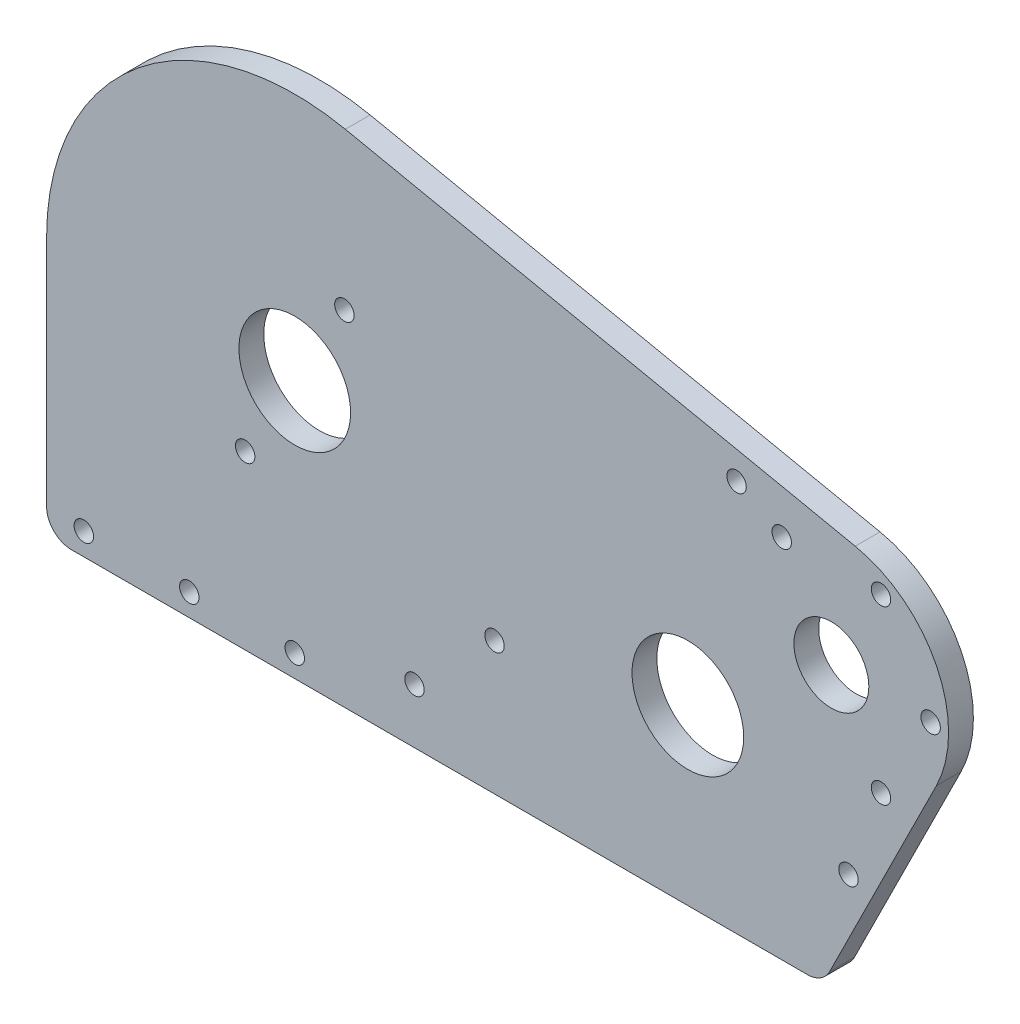
ISO-10303-21;
HEADER;
FILE_DESCRIPTION(('STEP AP214'),'2;1');
FILE_NAME('part.step','',(''),(''),'','','');
FILE_SCHEMA(('AUTOMOTIVE_DESIGN { 1 0 10303 214 1 1 1 1 }'));
ENDSEC;
DATA;
#1=APPLICATION_CONTEXT('core data for automotive mechanical design processes');
#2=APPLICATION_PROTOCOL_DEFINITION('international standard','automotive_design',2000,#1);
#3=PRODUCT_CONTEXT('',#1,'mechanical');
#4=PRODUCT('Part','Part','',(#3));
#5=PRODUCT_RELATED_PRODUCT_CATEGORY('part','',(#4));
#6=PRODUCT_DEFINITION_FORMATION('','',#4);
#7=PRODUCT_DEFINITION_CONTEXT('part definition',#1,'design');
#8=PRODUCT_DEFINITION('design','',#6,#7);
#9=PRODUCT_DEFINITION_SHAPE('','',#8);
#10=(LENGTH_UNIT() NAMED_UNIT(*) SI_UNIT(.MILLI.,.METRE.));
#11=(NAMED_UNIT(*) PLANE_ANGLE_UNIT() SI_UNIT($,.RADIAN.));
#12=(NAMED_UNIT(*) SI_UNIT($,.STERADIAN.) SOLID_ANGLE_UNIT());
#13=UNCERTAINTY_MEASURE_WITH_UNIT(LENGTH_MEASURE(1.E-05),#10,'distance_accuracy_value','');
#14=(GEOMETRIC_REPRESENTATION_CONTEXT(3) GLOBAL_UNCERTAINTY_ASSIGNED_CONTEXT((#13)) GLOBAL_UNIT_ASSIGNED_CONTEXT((#10,
#11,#12)) REPRESENTATION_CONTEXT('',''));
#15=CARTESIAN_POINT('',(0.,0.,0.));
#16=DIRECTION('',(0.,0.,1.));
#17=DIRECTION('',(1.,0.,0.));
#18=AXIS2_PLACEMENT_3D('',#15,#16,#17);
#19=CARTESIAN_POINT('',(152.4,220.726,6.35));
#20=DIRECTION('',(0.,0.,1.));
#21=DIRECTION('',(1.,0.,0.));
#22=AXIS2_PLACEMENT_3D('',#19,#20,#21);
#23=PLANE('',#22);
#24=CARTESIAN_POINT('',(139.7,198.728954743875,6.35));
#25=DIRECTION('',(0.,0.,1.));
#26=DIRECTION('',(1.,0.,0.));
#27=AXIS2_PLACEMENT_3D('',#24,#25,#26);
#28=CIRCLE('',#27,2.48920000000001);
#29=CARTESIAN_POINT('',(142.1892,198.728954743875,6.35));
#30=VERTEX_POINT('',#29);
#31=EDGE_CURVE('E276',#30,#30,#28,.T.);
#32=ORIENTED_EDGE('',*,*,#31,.F.);
#33=EDGE_LOOP('',(#32));
#34=FACE_BOUND('',#33,.T.);
#35=CARTESIAN_POINT('',(165.1,242.723045256125,6.35));
#36=DIRECTION('',(0.,0.,1.));
#37=DIRECTION('',(1.,0.,0.));
#38=AXIS2_PLACEMENT_3D('',#35,#36,#37);
#39=CIRCLE('',#38,2.48920000000001);
#40=CARTESIAN_POINT('',(167.5892,242.723045256125,6.35));
#41=VERTEX_POINT('',#40);
#42=EDGE_CURVE('E273',#41,#41,#39,.T.);
#43=ORIENTED_EDGE('',*,*,#42,.F.);
#44=EDGE_LOOP('',(#43));
#45=FACE_BOUND('',#44,.T.);
#46=CARTESIAN_POINT('',(289.700470913641,226.372782487758,6.35));
#47=DIRECTION('',(0.,0.,1.));
#48=DIRECTION('',(1.,0.,0.));
#49=AXIS2_PLACEMENT_3D('',#46,#47,#48);
#50=CIRCLE('',#49,9.5885);
#51=CARTESIAN_POINT('',(299.288970913641,226.372782487758,6.35));
#52=VERTEX_POINT('',#51);
#53=EDGE_CURVE('E255',#52,#52,#50,.T.);
#54=ORIENTED_EDGE('',*,*,#53,.F.);
#55=EDGE_LOOP('',(#54));
#56=FACE_BOUND('',#55,.T.);
#57=CARTESIAN_POINT('',(98.425,160.401,6.35));
#58=DIRECTION('',(0.,0.,1.));
#59=DIRECTION('',(1.,0.,0.));
#60=AXIS2_PLACEMENT_3D('',#57,#58,#59);
#61=CIRCLE('',#60,2.48920000000002);
#62=CARTESIAN_POINT('',(100.9142,160.401,6.35));
#63=VERTEX_POINT('',#62);
#64=EDGE_CURVE('E243',#63,#63,#61,.T.);
#65=ORIENTED_EDGE('',*,*,#64,.F.);
#66=EDGE_LOOP('',(#65));
#67=FACE_BOUND('',#66,.T.);
#68=CARTESIAN_POINT('',(152.4,160.401,6.35));
#69=DIRECTION('',(0.,0.,1.));
#70=DIRECTION('',(1.,0.,0.));
#71=AXIS2_PLACEMENT_3D('',#68,#69,#70);
#72=CIRCLE('',#71,2.48920000000001);
#73=CARTESIAN_POINT('',(154.8892,160.401,6.35));
#74=VERTEX_POINT('',#73);
#75=EDGE_CURVE('E231',#74,#74,#72,.T.);
#76=ORIENTED_EDGE('',*,*,#75,.F.);
#77=EDGE_LOOP('',(#76));
#78=FACE_BOUND('',#77,.T.);
#79=CARTESIAN_POINT('',(203.511307769551,188.683218549473,6.35));
#80=DIRECTION('',(0.,0.,1.));
#81=DIRECTION('',(1.,0.,0.));
#82=AXIS2_PLACEMENT_3D('',#79,#80,#81);
#83=CIRCLE('',#82,2.48920000000001);
#84=CARTESIAN_POINT('',(206.000507769551,188.683218549473,6.35));
#85=VERTEX_POINT('',#84);
#86=EDGE_CURVE('E219',#85,#85,#83,.T.);
#87=ORIENTED_EDGE('',*,*,#86,.F.);
#88=EDGE_LOOP('',(#87));
#89=FACE_BOUND('',#88,.T.);
#90=CARTESIAN_POINT('',(265.444839337782,254.926075850454,6.35));
#91=DIRECTION('',(0.,0.,1.));
#92=DIRECTION('',(1.,0.,0.));
#93=AXIS2_PLACEMENT_3D('',#90,#91,#92);
#94=CIRCLE('',#93,2.48920000000001);
#95=CARTESIAN_POINT('',(267.934039337782,254.926075850454,6.35));
#96=VERTEX_POINT('',#95);
#97=EDGE_CURVE('E207',#96,#96,#94,.T.);
#98=ORIENTED_EDGE('',*,*,#97,.F.);
#99=EDGE_LOOP('',(#98));
#100=FACE_BOUND('',#99,.T.);
#101=CARTESIAN_POINT('',(302.400470913641,248.369827743882,6.35));
#102=DIRECTION('',(0.,0.,1.));
#103=DIRECTION('',(1.,0.,0.));
#104=AXIS2_PLACEMENT_3D('',#101,#102,#103);
#105=CIRCLE('',#104,2.48919999999983);
#106=CARTESIAN_POINT('',(304.889670913641,248.369827743882,6.35));
#107=VERTEX_POINT('',#106);
#108=EDGE_CURVE('E195',#107,#107,#105,.T.);
#109=ORIENTED_EDGE('',*,*,#108,.F.);
#110=EDGE_LOOP('',(#109));
#111=FACE_BOUND('',#110,.T.);
#112=CARTESIAN_POINT('',(302.400470913641,204.375737231633,6.35));
#113=DIRECTION('',(0.,0.,1.));
#114=DIRECTION('',(1.,0.,0.));
#115=AXIS2_PLACEMENT_3D('',#112,#113,#114);
#116=CIRCLE('',#115,2.48920000000001);
#117=CARTESIAN_POINT('',(304.889670913641,204.375737231633,6.35));
#118=VERTEX_POINT('',#117);
#119=EDGE_CURVE('E181',#118,#118,#116,.T.);
#120=ORIENTED_EDGE('',*,*,#119,.F.);
#121=EDGE_LOOP('',(#120));
#122=FACE_BOUND('',#121,.T.);
#123=DIRECTION('',(1.,0.,0.));
#124=VECTOR('',#123,1.);
#125=CARTESIAN_POINT('',(88.8999999999999,154.686,6.35));
#126=LINE('',#125,#124);
#127=CARTESIAN_POINT('',(95.2499999999999,154.686,6.35));
#128=VERTEX_POINT('',#127);
#129=CARTESIAN_POINT('',(283.578317094878,154.686,6.35));
#130=VERTEX_POINT('',#129);
#131=EDGE_CURVE('E109',#128,#130,#126,.T.);
#132=ORIENTED_EDGE('',*,*,#131,.T.);
#133=CARTESIAN_POINT('',(283.578317094878,161.036,6.35));
#134=DIRECTION('',(0.,0.,1.));
#135=DIRECTION('',(1.,0.,0.));
#136=AXIS2_PLACEMENT_3D('',#133,#134,#135);
#137=CIRCLE('',#136,6.35);
#138=CARTESIAN_POINT('',(289.262390482921,158.205132691323,6.35));
#139=VERTEX_POINT('',#138);
#140=EDGE_CURVE('E45',#130,#139,#137,.T.);
#141=ORIENTED_EDGE('',*,*,#140,.T.);
#142=DIRECTION('',(0.44580587538221,0.895129667408416,0.));
#143=VECTOR('',#142,1.);
#144=CARTESIAN_POINT('',(287.509739345144,154.686,6.35));
#145=LINE('',#144,#143);
#146=CARTESIAN_POINT('',(316.552033598758,212.999765321568,6.35));
#147=VERTEX_POINT('',#146);
#148=EDGE_CURVE('E145',#139,#147,#145,.T.);
#149=ORIENTED_EDGE('',*,*,#148,.T.);
#150=CARTESIAN_POINT('',(289.700470913641,226.372782487758,6.35));
#151=DIRECTION('',(0.,0.,1.));
#152=DIRECTION('',(1.,0.,0.));
#153=AXIS2_PLACEMENT_3D('',#150,#151,#152);
#154=CIRCLE('',#153,29.9973999999995);
#155=CARTESIAN_POINT('',(295.812286775086,255.740957671718,6.35));
#156=VERTEX_POINT('',#155);
#157=EDGE_CURVE('E153',#147,#156,#154,.T.);
#158=ORIENTED_EDGE('',*,*,#157,.T.);
#159=DIRECTION('',(-0.979024021547217,0.203744853268775,0.));
#160=VECTOR('',#159,1.);
#161=CARTESIAN_POINT('',(165.337798182567,282.894025368248,6.35));
#162=LINE('',#161,#160);
#163=CARTESIAN_POINT('',(165.337798182567,282.894025368248,6.35));
#164=VERTEX_POINT('',#163);
#165=EDGE_CURVE('E115',#156,#164,#162,.T.);
#166=ORIENTED_EDGE('',*,*,#165,.T.);
#167=CARTESIAN_POINT('',(152.4,220.726,6.35));
#168=DIRECTION('',(0.,0.,1.));
#169=DIRECTION('',(1.,0.,0.));
#170=AXIS2_PLACEMENT_3D('',#167,#168,#169);
#171=CIRCLE('',#170,63.5);
#172=CARTESIAN_POINT('',(88.8999999999999,220.726,6.35));
#173=VERTEX_POINT('',#172);
#174=EDGE_CURVE('E110',#164,#173,#171,.T.);
#175=ORIENTED_EDGE('',*,*,#174,.T.);
#176=DIRECTION('',(0.,-1.,0.));
#177=VECTOR('',#176,1.);
#178=CARTESIAN_POINT('',(88.8999999999999,220.726,6.35));
#179=LINE('',#178,#177);
#180=CARTESIAN_POINT('',(88.8999999999999,161.036,6.35));
#181=VERTEX_POINT('',#180);
#182=EDGE_CURVE('E101',#173,#181,#179,.T.);
#183=ORIENTED_EDGE('',*,*,#182,.T.);
#184=CARTESIAN_POINT('',(95.2499999999999,161.036,6.35));
#185=DIRECTION('',(0.,0.,1.));
#186=DIRECTION('',(1.,0.,0.));
#187=AXIS2_PLACEMENT_3D('',#184,#185,#186);
#188=CIRCLE('',#187,6.35);
#189=EDGE_CURVE('E142',#181,#128,#188,.T.);
#190=ORIENTED_EDGE('',*,*,#189,.T.);
#191=EDGE_LOOP('',(#132,#141,#149,#158,#166,#175,#183,#190));
#192=FACE_BOUND('',#191,.T.);
#193=CARTESIAN_POINT('',(315.100470913641,226.372782487758,6.35));
#194=DIRECTION('',(0.,0.,1.));
#195=DIRECTION('',(1.,0.,0.));
#196=AXIS2_PLACEMENT_3D('',#193,#194,#195);
#197=CIRCLE('',#196,2.48920000000012);
#198=CARTESIAN_POINT('',(317.589670913641,226.372782487758,6.35));
#199=VERTEX_POINT('',#198);
#200=EDGE_CURVE('E190',#199,#199,#197,.T.);
#201=ORIENTED_EDGE('',*,*,#200,.F.);
#202=EDGE_LOOP('',(#201));
#203=FACE_BOUND('',#202,.T.);
#204=CARTESIAN_POINT('',(277.000470913641,248.369827743882,6.35));
#205=DIRECTION('',(0.,0.,1.));
#206=DIRECTION('',(1.,0.,0.));
#207=AXIS2_PLACEMENT_3D('',#204,#205,#206);
#208=CIRCLE('',#207,2.48919999999995);
#209=CARTESIAN_POINT('',(279.489670913641,248.369827743882,6.35));
#210=VERTEX_POINT('',#209);
#211=EDGE_CURVE('E201',#210,#210,#208,.T.);
#212=ORIENTED_EDGE('',*,*,#211,.F.);
#213=EDGE_LOOP('',(#212));
#214=FACE_BOUND('',#213,.T.);
#215=CARTESIAN_POINT('',(294.088813848959,182.139933311133,6.35));
#216=DIRECTION('',(0.,0.,1.));
#217=DIRECTION('',(1.,0.,0.));
#218=AXIS2_PLACEMENT_3D('',#215,#216,#217);
#219=CIRCLE('',#218,2.48920000000001);
#220=CARTESIAN_POINT('',(296.578013848959,182.139933311133,6.35));
#221=VERTEX_POINT('',#220);
#222=EDGE_CURVE('E213',#221,#221,#219,.T.);
#223=ORIENTED_EDGE('',*,*,#222,.F.);
#224=EDGE_LOOP('',(#223));
#225=FACE_BOUND('',#224,.T.);
#226=CARTESIAN_POINT('',(183.030900697863,168.756263157895,6.35));
#227=DIRECTION('',(0.,0.,1.));
#228=DIRECTION('',(1.,0.,0.));
#229=AXIS2_PLACEMENT_3D('',#226,#227,#228);
#230=CIRCLE('',#229,2.48920000000001);
#231=CARTESIAN_POINT('',(185.520100697863,168.756263157895,6.35));
#232=VERTEX_POINT('',#231);
#233=EDGE_CURVE('E225',#232,#232,#230,.T.);
#234=ORIENTED_EDGE('',*,*,#233,.F.);
#235=EDGE_LOOP('',(#234));
#236=FACE_BOUND('',#235,.T.);
#237=CARTESIAN_POINT('',(125.4125,160.401,6.35));
#238=DIRECTION('',(0.,0.,1.));
#239=DIRECTION('',(1.,0.,0.));
#240=AXIS2_PLACEMENT_3D('',#237,#238,#239);
#241=CIRCLE('',#240,2.48920000000001);
#242=CARTESIAN_POINT('',(127.9017,160.401,6.35));
#243=VERTEX_POINT('',#242);
#244=EDGE_CURVE('E237',#243,#243,#241,.T.);
#245=ORIENTED_EDGE('',*,*,#244,.F.);
#246=EDGE_LOOP('',(#245));
#247=FACE_BOUND('',#246,.T.);
#248=CARTESIAN_POINT('',(252.978868555974,199.136,6.35));
#249=DIRECTION('',(0.,0.,1.));
#250=DIRECTION('',(1.,0.,0.));
#251=AXIS2_PLACEMENT_3D('',#248,#249,#250);
#252=CIRCLE('',#251,14.2875);
#253=CARTESIAN_POINT('',(267.266368555974,199.136,6.35));
#254=VERTEX_POINT('',#253);
#255=EDGE_CURVE('E249',#254,#254,#252,.T.);
#256=ORIENTED_EDGE('',*,*,#255,.F.);
#257=EDGE_LOOP('',(#256));
#258=FACE_BOUND('',#257,.T.);
#259=CARTESIAN_POINT('',(152.4,220.726,6.35));
#260=DIRECTION('',(0.,0.,1.));
#261=DIRECTION('',(1.,0.,0.));
#262=AXIS2_PLACEMENT_3D('',#259,#260,#261);
#263=CIRCLE('',#262,14.2875);
#264=CARTESIAN_POINT('',(166.6875,220.726,6.35));
#265=VERTEX_POINT('',#264);
#266=EDGE_CURVE('E261',#265,#265,#263,.T.);
#267=ORIENTED_EDGE('',*,*,#266,.F.);
#268=EDGE_LOOP('',(#267));
#269=FACE_BOUND('',#268,.T.);
#270=ADVANCED_FACE('F37',(#34,#45,#56,#67,#78,#89,#100,#111,#122,#192,#203,#214,#225,#236,#247,
#258,#269),#23,.T.);
#271=CARTESIAN_POINT('',(152.4,220.726,0.));
#272=DIRECTION('',(0.,0.,1.));
#273=DIRECTION('',(1.,0.,0.));
#274=AXIS2_PLACEMENT_3D('',#271,#272,#273);
#275=PLANE('',#274);
#276=CARTESIAN_POINT('',(139.7,198.728954743875,0.));
#277=DIRECTION('',(0.,0.,1.));
#278=DIRECTION('',(1.,0.,0.));
#279=AXIS2_PLACEMENT_3D('',#276,#277,#278);
#280=CIRCLE('',#279,2.48920000000001);
#281=CARTESIAN_POINT('',(142.1892,198.728954743875,0.));
#282=VERTEX_POINT('',#281);
#283=EDGE_CURVE('E267',#282,#282,#280,.T.);
#284=ORIENTED_EDGE('',*,*,#283,.T.);
#285=EDGE_LOOP('',(#284));
#286=FACE_BOUND('',#285,.T.);
#287=CARTESIAN_POINT('',(165.1,242.723045256125,0.));
#288=DIRECTION('',(0.,0.,1.));
#289=DIRECTION('',(1.,0.,0.));
#290=AXIS2_PLACEMENT_3D('',#287,#288,#289);
#291=CIRCLE('',#290,2.48920000000001);
#292=CARTESIAN_POINT('',(167.5892,242.723045256125,0.));
#293=VERTEX_POINT('',#292);
#294=EDGE_CURVE('E270',#293,#293,#291,.T.);
#295=ORIENTED_EDGE('',*,*,#294,.T.);
#296=EDGE_LOOP('',(#295));
#297=FACE_BOUND('',#296,.T.);
#298=DIRECTION('',(0.44580587538221,0.895129667408416,0.));
#299=VECTOR('',#298,1.);
#300=CARTESIAN_POINT('',(287.509739345144,154.686,0.));
#301=LINE('',#300,#299);
#302=CARTESIAN_POINT('',(289.262390482921,158.205132691323,0.));
#303=VERTEX_POINT('',#302);
#304=CARTESIAN_POINT('',(316.552033598758,212.999765321568,0.));
#305=VERTEX_POINT('',#304);
#306=EDGE_CURVE('E162',#303,#305,#301,.T.);
#307=ORIENTED_EDGE('',*,*,#306,.F.);
#308=CARTESIAN_POINT('',(283.578317094878,161.036,0.));
#309=DIRECTION('',(0.,0.,1.));
#310=DIRECTION('',(1.,0.,0.));
#311=AXIS2_PLACEMENT_3D('',#308,#309,#310);
#312=CIRCLE('',#311,6.35);
#313=CARTESIAN_POINT('',(283.578317094878,154.686,0.));
#314=VERTEX_POINT('',#313);
#315=EDGE_CURVE('E136',#303,#314,#312,.F.);
#316=ORIENTED_EDGE('',*,*,#315,.T.);
#317=DIRECTION('',(1.,0.,0.));
#318=VECTOR('',#317,1.);
#319=CARTESIAN_POINT('',(260.35,154.686,0.));
#320=LINE('',#319,#318);
#321=CARTESIAN_POINT('',(95.2499999999999,154.686,0.));
#322=VERTEX_POINT('',#321);
#323=EDGE_CURVE('E160',#322,#314,#320,.T.);
#324=ORIENTED_EDGE('',*,*,#323,.F.);
#325=CARTESIAN_POINT('',(95.2499999999999,161.036,0.));
#326=DIRECTION('',(0.,0.,1.));
#327=DIRECTION('',(1.,0.,0.));
#328=AXIS2_PLACEMENT_3D('',#325,#326,#327);
#329=CIRCLE('',#328,6.35);
#330=CARTESIAN_POINT('',(88.8999999999999,161.036,0.));
#331=VERTEX_POINT('',#330);
#332=EDGE_CURVE('E128',#322,#331,#329,.F.);
#333=ORIENTED_EDGE('',*,*,#332,.T.);
#334=DIRECTION('',(0.,-1.,0.));
#335=VECTOR('',#334,1.);
#336=CARTESIAN_POINT('',(88.8999999999999,220.726,0.));
#337=LINE('',#336,#335);
#338=CARTESIAN_POINT('',(88.8999999999999,220.726,0.));
#339=VERTEX_POINT('',#338);
#340=EDGE_CURVE('E165',#339,#331,#337,.T.);
#341=ORIENTED_EDGE('',*,*,#340,.F.);
#342=CARTESIAN_POINT('',(152.4,220.726,0.));
#343=DIRECTION('',(0.,0.,1.));
#344=DIRECTION('',(1.,0.,0.));
#345=AXIS2_PLACEMENT_3D('',#342,#343,#344);
#346=CIRCLE('',#345,63.5);
#347=CARTESIAN_POINT('',(165.337798182567,282.894025368248,0.));
#348=VERTEX_POINT('',#347);
#349=EDGE_CURVE('E123',#348,#339,#346,.T.);
#350=ORIENTED_EDGE('',*,*,#349,.F.);
#351=DIRECTION('',(-0.979024021547217,0.203744853268775,0.));
#352=VECTOR('',#351,1.);
#353=CARTESIAN_POINT('',(165.337798182567,282.894025368248,0.));
#354=LINE('',#353,#352);
#355=CARTESIAN_POINT('',(295.812286775086,255.740957671718,0.));
#356=VERTEX_POINT('',#355);
#357=EDGE_CURVE('E119',#356,#348,#354,.T.);
#358=ORIENTED_EDGE('',*,*,#357,.F.);
#359=CARTESIAN_POINT('',(289.700470913641,226.372782487758,0.));
#360=DIRECTION('',(0.,0.,1.));
#361=DIRECTION('',(1.,0.,0.));
#362=AXIS2_PLACEMENT_3D('',#359,#360,#361);
#363=CIRCLE('',#362,29.9973999999995);
#364=EDGE_CURVE('E167',#305,#356,#363,.T.);
#365=ORIENTED_EDGE('',*,*,#364,.F.);
#366=EDGE_LOOP('',(#307,#316,#324,#333,#341,#350,#358,#365));
#367=FACE_BOUND('',#366,.T.);
#368=CARTESIAN_POINT('',(302.400470913641,204.375737231633,0.));
#369=DIRECTION('',(0.,0.,1.));
#370=DIRECTION('',(1.,0.,0.));
#371=AXIS2_PLACEMENT_3D('',#368,#369,#370);
#372=CIRCLE('',#371,2.48920000000001);
#373=CARTESIAN_POINT('',(304.889670913641,204.375737231633,0.));
#374=VERTEX_POINT('',#373);
#375=EDGE_CURVE('E183',#374,#374,#372,.T.);
#376=ORIENTED_EDGE('',*,*,#375,.T.);
#377=EDGE_LOOP('',(#376));
#378=FACE_BOUND('',#377,.T.);
#379=CARTESIAN_POINT('',(315.100470913641,226.372782487758,0.));
#380=DIRECTION('',(0.,0.,1.));
#381=DIRECTION('',(1.,0.,0.));
#382=AXIS2_PLACEMENT_3D('',#379,#380,#381);
#383=CIRCLE('',#382,2.48920000000012);
#384=CARTESIAN_POINT('',(317.589670913641,226.372782487758,0.));
#385=VERTEX_POINT('',#384);
#386=EDGE_CURVE('E192',#385,#385,#383,.T.);
#387=ORIENTED_EDGE('',*,*,#386,.T.);
#388=EDGE_LOOP('',(#387));
#389=FACE_BOUND('',#388,.T.);
#390=CARTESIAN_POINT('',(302.400470913641,248.369827743882,0.));
#391=DIRECTION('',(0.,0.,1.));
#392=DIRECTION('',(1.,0.,0.));
#393=AXIS2_PLACEMENT_3D('',#390,#391,#392);
#394=CIRCLE('',#393,2.48919999999983);
#395=CARTESIAN_POINT('',(304.889670913641,248.369827743882,0.));
#396=VERTEX_POINT('',#395);
#397=EDGE_CURVE('E198',#396,#396,#394,.T.);
#398=ORIENTED_EDGE('',*,*,#397,.T.);
#399=EDGE_LOOP('',(#398));
#400=FACE_BOUND('',#399,.T.);
#401=CARTESIAN_POINT('',(277.000470913641,248.369827743882,0.));
#402=DIRECTION('',(0.,0.,1.));
#403=DIRECTION('',(1.,0.,0.));
#404=AXIS2_PLACEMENT_3D('',#401,#402,#403);
#405=CIRCLE('',#404,2.48919999999995);
#406=CARTESIAN_POINT('',(279.489670913641,248.369827743882,0.));
#407=VERTEX_POINT('',#406);
#408=EDGE_CURVE('E204',#407,#407,#405,.T.);
#409=ORIENTED_EDGE('',*,*,#408,.T.);
#410=EDGE_LOOP('',(#409));
#411=FACE_BOUND('',#410,.T.);
#412=CARTESIAN_POINT('',(265.444839337782,254.926075850454,0.));
#413=DIRECTION('',(0.,0.,1.));
#414=DIRECTION('',(1.,0.,0.));
#415=AXIS2_PLACEMENT_3D('',#412,#413,#414);
#416=CIRCLE('',#415,2.48920000000001);
#417=CARTESIAN_POINT('',(267.934039337782,254.926075850454,0.));
#418=VERTEX_POINT('',#417);
#419=EDGE_CURVE('E210',#418,#418,#416,.T.);
#420=ORIENTED_EDGE('',*,*,#419,.T.);
#421=EDGE_LOOP('',(#420));
#422=FACE_BOUND('',#421,.T.);
#423=CARTESIAN_POINT('',(294.088813848959,182.139933311133,0.));
#424=DIRECTION('',(0.,0.,1.));
#425=DIRECTION('',(1.,0.,0.));
#426=AXIS2_PLACEMENT_3D('',#423,#424,#425);
#427=CIRCLE('',#426,2.48920000000001);
#428=CARTESIAN_POINT('',(296.578013848959,182.139933311133,0.));
#429=VERTEX_POINT('',#428);
#430=EDGE_CURVE('E216',#429,#429,#427,.T.);
#431=ORIENTED_EDGE('',*,*,#430,.T.);
#432=EDGE_LOOP('',(#431));
#433=FACE_BOUND('',#432,.T.);
#434=CARTESIAN_POINT('',(203.511307769551,188.683218549473,0.));
#435=DIRECTION('',(0.,0.,1.));
#436=DIRECTION('',(1.,0.,0.));
#437=AXIS2_PLACEMENT_3D('',#434,#435,#436);
#438=CIRCLE('',#437,2.48920000000001);
#439=CARTESIAN_POINT('',(206.000507769551,188.683218549473,0.));
#440=VERTEX_POINT('',#439);
#441=EDGE_CURVE('E222',#440,#440,#438,.T.);
#442=ORIENTED_EDGE('',*,*,#441,.T.);
#443=EDGE_LOOP('',(#442));
#444=FACE_BOUND('',#443,.T.);
#445=CARTESIAN_POINT('',(183.030900697863,168.756263157895,0.));
#446=DIRECTION('',(0.,0.,1.));
#447=DIRECTION('',(1.,0.,0.));
#448=AXIS2_PLACEMENT_3D('',#445,#446,#447);
#449=CIRCLE('',#448,2.48920000000001);
#450=CARTESIAN_POINT('',(185.520100697863,168.756263157895,0.));
#451=VERTEX_POINT('',#450);
#452=EDGE_CURVE('E228',#451,#451,#449,.T.);
#453=ORIENTED_EDGE('',*,*,#452,.T.);
#454=EDGE_LOOP('',(#453));
#455=FACE_BOUND('',#454,.T.);
#456=CARTESIAN_POINT('',(152.4,160.401,0.));
#457=DIRECTION('',(0.,0.,1.));
#458=DIRECTION('',(1.,0.,0.));
#459=AXIS2_PLACEMENT_3D('',#456,#457,#458);
#460=CIRCLE('',#459,2.48920000000001);
#461=CARTESIAN_POINT('',(154.8892,160.401,0.));
#462=VERTEX_POINT('',#461);
#463=EDGE_CURVE('E234',#462,#462,#460,.T.);
#464=ORIENTED_EDGE('',*,*,#463,.T.);
#465=EDGE_LOOP('',(#464));
#466=FACE_BOUND('',#465,.T.);
#467=CARTESIAN_POINT('',(125.4125,160.401,0.));
#468=DIRECTION('',(0.,0.,1.));
#469=DIRECTION('',(1.,0.,0.));
#470=AXIS2_PLACEMENT_3D('',#467,#468,#469);
#471=CIRCLE('',#470,2.48920000000001);
#472=CARTESIAN_POINT('',(127.9017,160.401,0.));
#473=VERTEX_POINT('',#472);
#474=EDGE_CURVE('E240',#473,#473,#471,.T.);
#475=ORIENTED_EDGE('',*,*,#474,.T.);
#476=EDGE_LOOP('',(#475));
#477=FACE_BOUND('',#476,.T.);
#478=CARTESIAN_POINT('',(98.425,160.401,0.));
#479=DIRECTION('',(0.,0.,1.));
#480=DIRECTION('',(1.,0.,0.));
#481=AXIS2_PLACEMENT_3D('',#478,#479,#480);
#482=CIRCLE('',#481,2.48920000000002);
#483=CARTESIAN_POINT('',(100.9142,160.401,0.));
#484=VERTEX_POINT('',#483);
#485=EDGE_CURVE('E246',#484,#484,#482,.T.);
#486=ORIENTED_EDGE('',*,*,#485,.T.);
#487=EDGE_LOOP('',(#486));
#488=FACE_BOUND('',#487,.T.);
#489=CARTESIAN_POINT('',(252.978868555974,199.136,0.));
#490=DIRECTION('',(0.,0.,1.));
#491=DIRECTION('',(1.,0.,0.));
#492=AXIS2_PLACEMENT_3D('',#489,#490,#491);
#493=CIRCLE('',#492,14.2875);
#494=CARTESIAN_POINT('',(267.266368555974,199.136,0.));
#495=VERTEX_POINT('',#494);
#496=EDGE_CURVE('E252',#495,#495,#493,.T.);
#497=ORIENTED_EDGE('',*,*,#496,.T.);
#498=EDGE_LOOP('',(#497));
#499=FACE_BOUND('',#498,.T.);
#500=CARTESIAN_POINT('',(289.700470913641,226.372782487758,0.));
#501=DIRECTION('',(0.,0.,1.));
#502=DIRECTION('',(1.,0.,0.));
#503=AXIS2_PLACEMENT_3D('',#500,#501,#502);
#504=CIRCLE('',#503,9.5885);
#505=CARTESIAN_POINT('',(299.288970913641,226.372782487758,0.));
#506=VERTEX_POINT('',#505);
#507=EDGE_CURVE('E258',#506,#506,#504,.T.);
#508=ORIENTED_EDGE('',*,*,#507,.T.);
#509=EDGE_LOOP('',(#508));
#510=FACE_BOUND('',#509,.T.);
#511=CARTESIAN_POINT('',(152.4,220.726,0.));
#512=DIRECTION('',(0.,0.,1.));
#513=DIRECTION('',(1.,0.,0.));
#514=AXIS2_PLACEMENT_3D('',#511,#512,#513);
#515=CIRCLE('',#514,14.2875);
#516=CARTESIAN_POINT('',(166.6875,220.726,0.));
#517=VERTEX_POINT('',#516);
#518=EDGE_CURVE('E264',#517,#517,#515,.T.);
#519=ORIENTED_EDGE('',*,*,#518,.T.);
#520=EDGE_LOOP('',(#519));
#521=FACE_BOUND('',#520,.T.);
#522=ADVANCED_FACE('F158',(#286,#297,#367,#378,#389,#400,#411,#422,#433,#444,#455,#466,#477,
#488,#499,#510,#521),#275,.F.);
#523=CARTESIAN_POINT('',(152.4,220.726,6.35));
#524=DIRECTION('',(0.,0.,-1.));
#525=DIRECTION('',(-1.,0.,0.));
#526=AXIS2_PLACEMENT_3D('',#523,#524,#525);
#527=CYLINDRICAL_SURFACE('',#526,63.5);
#528=ORIENTED_EDGE('',*,*,#349,.T.);
#529=DIRECTION('',(0.,0.,-1.));
#530=VECTOR('',#529,1.);
#531=CARTESIAN_POINT('',(88.8999999999999,220.726,6.35));
#532=LINE('',#531,#530);
#533=EDGE_CURVE('E105',#173,#339,#532,.T.);
#534=ORIENTED_EDGE('',*,*,#533,.F.);
#535=ORIENTED_EDGE('',*,*,#174,.F.);
#536=DIRECTION('',(0.,0.,-1.));
#537=VECTOR('',#536,1.);
#538=CARTESIAN_POINT('',(165.337798182567,282.894025368248,6.35));
#539=LINE('',#538,#537);
#540=EDGE_CURVE('E174',#164,#348,#539,.T.);
#541=ORIENTED_EDGE('',*,*,#540,.T.);
#542=EDGE_LOOP('',(#528,#534,#535,#541));
#543=FACE_BOUND('',#542,.T.);
#544=ADVANCED_FACE('F121',(#543),#527,.T.);
#545=CARTESIAN_POINT('',(88.8999999999999,220.726,6.35));
#546=DIRECTION('',(1.,0.,0.));
#547=DIRECTION('',(0.,1.,0.));
#548=AXIS2_PLACEMENT_3D('',#545,#546,#547);
#549=PLANE('',#548);
#550=ORIENTED_EDGE('',*,*,#340,.T.);
#551=DIRECTION('',(0.,0.,-1.));
#552=VECTOR('',#551,1.);
#553=CARTESIAN_POINT('',(88.8999999999999,161.036,6.35));
#554=LINE('',#553,#552);
#555=EDGE_CURVE('E11',#331,#181,#554,.F.);
#556=ORIENTED_EDGE('',*,*,#555,.T.);
#557=ORIENTED_EDGE('',*,*,#182,.F.);
#558=ORIENTED_EDGE('',*,*,#533,.T.);
#559=EDGE_LOOP('',(#550,#556,#557,#558));
#560=FACE_BOUND('',#559,.T.);
#561=ADVANCED_FACE('F103',(#560),#549,.F.);
#562=CARTESIAN_POINT('',(260.35,154.686,6.35));
#563=DIRECTION('',(0.,1.,0.));
#564=DIRECTION('',(0.,0.,1.));
#565=AXIS2_PLACEMENT_3D('',#562,#563,#564);
#566=PLANE('',#565);
#567=ORIENTED_EDGE('',*,*,#323,.T.);
#568=DIRECTION('',(0.,0.,-1.));
#569=VECTOR('',#568,1.);
#570=CARTESIAN_POINT('',(283.578317094878,154.686,6.35));
#571=LINE('',#570,#569);
#572=EDGE_CURVE('E58',#314,#130,#571,.F.);
#573=ORIENTED_EDGE('',*,*,#572,.T.);
#574=ORIENTED_EDGE('',*,*,#131,.F.);
#575=DIRECTION('',(0.,0.,-1.));
#576=VECTOR('',#575,1.);
#577=CARTESIAN_POINT('',(95.2499999999999,154.686,6.35));
#578=LINE('',#577,#576);
#579=EDGE_CURVE('E138',#128,#322,#578,.T.);
#580=ORIENTED_EDGE('',*,*,#579,.T.);
#581=EDGE_LOOP('',(#567,#573,#574,#580));
#582=FACE_BOUND('',#581,.T.);
#583=ADVANCED_FACE('F163',(#582),#566,.F.);
#584=CARTESIAN_POINT('',(287.509739345144,154.686,6.35));
#585=DIRECTION('',(-0.895129667408416,0.44580587538221,0.));
#586=DIRECTION('',(-0.44580587538221,-0.895129667408416,0.));
#587=AXIS2_PLACEMENT_3D('',#584,#585,#586);
#588=PLANE('',#587);
#589=ORIENTED_EDGE('',*,*,#148,.F.);
#590=DIRECTION('',(0.,0.,-1.));
#591=VECTOR('',#590,1.);
#592=CARTESIAN_POINT('',(289.262390482921,158.205132691323,6.35));
#593=LINE('',#592,#591);
#594=EDGE_CURVE('E124',#139,#303,#593,.T.);
#595=ORIENTED_EDGE('',*,*,#594,.T.);
#596=ORIENTED_EDGE('',*,*,#306,.T.);
#597=DIRECTION('',(0.,0.,-1.));
#598=VECTOR('',#597,1.);
#599=CARTESIAN_POINT('',(316.552033598758,212.999765321568,6.35));
#600=LINE('',#599,#598);
#601=EDGE_CURVE('E125',#147,#305,#600,.T.);
#602=ORIENTED_EDGE('',*,*,#601,.F.);
#603=EDGE_LOOP('',(#589,#595,#596,#602));
#604=FACE_BOUND('',#603,.T.);
#605=ADVANCED_FACE('F150',(#604),#588,.F.);
#606=CARTESIAN_POINT('',(289.700470913641,226.372782487758,6.35));
#607=DIRECTION('',(0.,0.,-1.));
#608=DIRECTION('',(-1.,0.,0.));
#609=AXIS2_PLACEMENT_3D('',#606,#607,#608);
#610=CYLINDRICAL_SURFACE('',#609,29.9973999999995);
#611=ORIENTED_EDGE('',*,*,#364,.T.);
#612=DIRECTION('',(0.,0.,-1.));
#613=VECTOR('',#612,1.);
#614=CARTESIAN_POINT('',(295.812286775086,255.740957671718,6.35));
#615=LINE('',#614,#613);
#616=EDGE_CURVE('E131',#156,#356,#615,.T.);
#617=ORIENTED_EDGE('',*,*,#616,.F.);
#618=ORIENTED_EDGE('',*,*,#157,.F.);
#619=ORIENTED_EDGE('',*,*,#601,.T.);
#620=EDGE_LOOP('',(#611,#617,#618,#619));
#621=FACE_BOUND('',#620,.T.);
#622=ADVANCED_FACE('F403',(#621),#610,.T.);
#623=CARTESIAN_POINT('',(165.337798182567,282.894025368248,6.35));
#624=DIRECTION('',(-0.203744853268775,-0.979024021547217,0.));
#625=DIRECTION('',(0.979024021547217,-0.203744853268775,0.));
#626=AXIS2_PLACEMENT_3D('',#623,#624,#625);
#627=PLANE('',#626);
#628=ORIENTED_EDGE('',*,*,#357,.T.);
#629=ORIENTED_EDGE('',*,*,#540,.F.);
#630=ORIENTED_EDGE('',*,*,#165,.F.);
#631=ORIENTED_EDGE('',*,*,#616,.T.);
#632=EDGE_LOOP('',(#628,#629,#630,#631));
#633=FACE_BOUND('',#632,.T.);
#634=ADVANCED_FACE('F179',(#633),#627,.F.);
#635=CARTESIAN_POINT('',(302.400470913641,204.375737231633,6.35));
#636=DIRECTION('',(0.,0.,-1.));
#637=DIRECTION('',(-1.,0.,0.));
#638=AXIS2_PLACEMENT_3D('',#635,#636,#637);
#639=CYLINDRICAL_SURFACE('',#638,2.48920000000001);
#640=ORIENTED_EDGE('',*,*,#119,.T.);
#641=EDGE_LOOP('',(#640));
#642=FACE_BOUND('',#641,.T.);
#643=ORIENTED_EDGE('',*,*,#375,.F.);
#644=EDGE_LOOP('',(#643));
#645=FACE_BOUND('',#644,.T.);
#646=ADVANCED_FACE('F310',(#642,#645),#639,.F.);
#647=CARTESIAN_POINT('',(315.100470913641,226.372782487758,6.35));
#648=DIRECTION('',(0.,0.,-1.));
#649=DIRECTION('',(-1.,0.,0.));
#650=AXIS2_PLACEMENT_3D('',#647,#648,#649);
#651=CYLINDRICAL_SURFACE('',#650,2.48920000000012);
#652=ORIENTED_EDGE('',*,*,#200,.T.);
#653=EDGE_LOOP('',(#652));
#654=FACE_BOUND('',#653,.T.);
#655=ORIENTED_EDGE('',*,*,#386,.F.);
#656=EDGE_LOOP('',(#655));
#657=FACE_BOUND('',#656,.T.);
#658=ADVANCED_FACE('F313',(#654,#657),#651,.F.);
#659=CARTESIAN_POINT('',(302.400470913641,248.369827743882,6.35));
#660=DIRECTION('',(0.,0.,-1.));
#661=DIRECTION('',(-1.,0.,0.));
#662=AXIS2_PLACEMENT_3D('',#659,#660,#661);
#663=CYLINDRICAL_SURFACE('',#662,2.48919999999983);
#664=ORIENTED_EDGE('',*,*,#108,.T.);
#665=EDGE_LOOP('',(#664));
#666=FACE_BOUND('',#665,.T.);
#667=ORIENTED_EDGE('',*,*,#397,.F.);
#668=EDGE_LOOP('',(#667));
#669=FACE_BOUND('',#668,.T.);
#670=ADVANCED_FACE('F393',(#666,#669),#663,.F.);
#671=CARTESIAN_POINT('',(277.000470913641,248.369827743882,6.35));
#672=DIRECTION('',(0.,0.,-1.));
#673=DIRECTION('',(-1.,0.,0.));
#674=AXIS2_PLACEMENT_3D('',#671,#672,#673);
#675=CYLINDRICAL_SURFACE('',#674,2.48919999999995);
#676=ORIENTED_EDGE('',*,*,#211,.T.);
#677=EDGE_LOOP('',(#676));
#678=FACE_BOUND('',#677,.T.);
#679=ORIENTED_EDGE('',*,*,#408,.F.);
#680=EDGE_LOOP('',(#679));
#681=FACE_BOUND('',#680,.T.);
#682=ADVANCED_FACE('F389',(#678,#681),#675,.F.);
#683=CARTESIAN_POINT('',(265.444839337782,254.926075850454,6.35));
#684=DIRECTION('',(0.,0.,-1.));
#685=DIRECTION('',(-1.,0.,0.));
#686=AXIS2_PLACEMENT_3D('',#683,#684,#685);
#687=CYLINDRICAL_SURFACE('',#686,2.48920000000001);
#688=ORIENTED_EDGE('',*,*,#97,.T.);
#689=EDGE_LOOP('',(#688));
#690=FACE_BOUND('',#689,.T.);
#691=ORIENTED_EDGE('',*,*,#419,.F.);
#692=EDGE_LOOP('',(#691));
#693=FACE_BOUND('',#692,.T.);
#694=ADVANCED_FACE('F385',(#690,#693),#687,.F.);
#695=CARTESIAN_POINT('',(294.088813848959,182.139933311133,6.35));
#696=DIRECTION('',(0.,0.,-1.));
#697=DIRECTION('',(-1.,0.,0.));
#698=AXIS2_PLACEMENT_3D('',#695,#696,#697);
#699=CYLINDRICAL_SURFACE('',#698,2.48920000000001);
#700=ORIENTED_EDGE('',*,*,#222,.T.);
#701=EDGE_LOOP('',(#700));
#702=FACE_BOUND('',#701,.T.);
#703=ORIENTED_EDGE('',*,*,#430,.F.);
#704=EDGE_LOOP('',(#703));
#705=FACE_BOUND('',#704,.T.);
#706=ADVANCED_FACE('F381',(#702,#705),#699,.F.);
#707=CARTESIAN_POINT('',(203.511307769551,188.683218549473,6.35));
#708=DIRECTION('',(0.,0.,-1.));
#709=DIRECTION('',(-1.,0.,0.));
#710=AXIS2_PLACEMENT_3D('',#707,#708,#709);
#711=CYLINDRICAL_SURFACE('',#710,2.48920000000001);
#712=ORIENTED_EDGE('',*,*,#86,.T.);
#713=EDGE_LOOP('',(#712));
#714=FACE_BOUND('',#713,.T.);
#715=ORIENTED_EDGE('',*,*,#441,.F.);
#716=EDGE_LOOP('',(#715));
#717=FACE_BOUND('',#716,.T.);
#718=ADVANCED_FACE('F377',(#714,#717),#711,.F.);
#719=CARTESIAN_POINT('',(183.030900697863,168.756263157895,6.35));
#720=DIRECTION('',(0.,0.,-1.));
#721=DIRECTION('',(-1.,0.,0.));
#722=AXIS2_PLACEMENT_3D('',#719,#720,#721);
#723=CYLINDRICAL_SURFACE('',#722,2.48920000000001);
#724=ORIENTED_EDGE('',*,*,#233,.T.);
#725=EDGE_LOOP('',(#724));
#726=FACE_BOUND('',#725,.T.);
#727=ORIENTED_EDGE('',*,*,#452,.F.);
#728=EDGE_LOOP('',(#727));
#729=FACE_BOUND('',#728,.T.);
#730=ADVANCED_FACE('F373',(#726,#729),#723,.F.);
#731=CARTESIAN_POINT('',(152.4,160.401,6.35));
#732=DIRECTION('',(0.,0.,-1.));
#733=DIRECTION('',(-1.,0.,0.));
#734=AXIS2_PLACEMENT_3D('',#731,#732,#733);
#735=CYLINDRICAL_SURFACE('',#734,2.48920000000001);
#736=ORIENTED_EDGE('',*,*,#75,.T.);
#737=EDGE_LOOP('',(#736));
#738=FACE_BOUND('',#737,.T.);
#739=ORIENTED_EDGE('',*,*,#463,.F.);
#740=EDGE_LOOP('',(#739));
#741=FACE_BOUND('',#740,.T.);
#742=ADVANCED_FACE('F369',(#738,#741),#735,.F.);
#743=CARTESIAN_POINT('',(125.4125,160.401,6.35));
#744=DIRECTION('',(0.,0.,-1.));
#745=DIRECTION('',(-1.,0.,0.));
#746=AXIS2_PLACEMENT_3D('',#743,#744,#745);
#747=CYLINDRICAL_SURFACE('',#746,2.48920000000001);
#748=ORIENTED_EDGE('',*,*,#244,.T.);
#749=EDGE_LOOP('',(#748));
#750=FACE_BOUND('',#749,.T.);
#751=ORIENTED_EDGE('',*,*,#474,.F.);
#752=EDGE_LOOP('',(#751));
#753=FACE_BOUND('',#752,.T.);
#754=ADVANCED_FACE('F365',(#750,#753),#747,.F.);
#755=CARTESIAN_POINT('',(98.425,160.401,6.35));
#756=DIRECTION('',(0.,0.,-1.));
#757=DIRECTION('',(-1.,0.,0.));
#758=AXIS2_PLACEMENT_3D('',#755,#756,#757);
#759=CYLINDRICAL_SURFACE('',#758,2.48920000000002);
#760=ORIENTED_EDGE('',*,*,#64,.T.);
#761=EDGE_LOOP('',(#760));
#762=FACE_BOUND('',#761,.T.);
#763=ORIENTED_EDGE('',*,*,#485,.F.);
#764=EDGE_LOOP('',(#763));
#765=FACE_BOUND('',#764,.T.);
#766=ADVANCED_FACE('F361',(#762,#765),#759,.F.);
#767=CARTESIAN_POINT('',(252.978868555974,199.136,6.35));
#768=DIRECTION('',(0.,0.,-1.));
#769=DIRECTION('',(-1.,0.,0.));
#770=AXIS2_PLACEMENT_3D('',#767,#768,#769);
#771=CYLINDRICAL_SURFACE('',#770,14.2875);
#772=ORIENTED_EDGE('',*,*,#255,.T.);
#773=EDGE_LOOP('',(#772));
#774=FACE_BOUND('',#773,.T.);
#775=ORIENTED_EDGE('',*,*,#496,.F.);
#776=EDGE_LOOP('',(#775));
#777=FACE_BOUND('',#776,.T.);
#778=ADVANCED_FACE('F354',(#774,#777),#771,.F.);
#779=CARTESIAN_POINT('',(289.700470913641,226.372782487758,6.35));
#780=DIRECTION('',(0.,0.,-1.));
#781=DIRECTION('',(-1.,0.,0.));
#782=AXIS2_PLACEMENT_3D('',#779,#780,#781);
#783=CYLINDRICAL_SURFACE('',#782,9.5885);
#784=ORIENTED_EDGE('',*,*,#53,.T.);
#785=EDGE_LOOP('',(#784));
#786=FACE_BOUND('',#785,.T.);
#787=ORIENTED_EDGE('',*,*,#507,.F.);
#788=EDGE_LOOP('',(#787));
#789=FACE_BOUND('',#788,.T.);
#790=ADVANCED_FACE('F347',(#786,#789),#783,.F.);
#791=CARTESIAN_POINT('',(152.4,220.726,6.35));
#792=DIRECTION('',(0.,0.,-1.));
#793=DIRECTION('',(-1.,0.,0.));
#794=AXIS2_PLACEMENT_3D('',#791,#792,#793);
#795=CYLINDRICAL_SURFACE('',#794,14.2875);
#796=ORIENTED_EDGE('',*,*,#266,.T.);
#797=EDGE_LOOP('',(#796));
#798=FACE_BOUND('',#797,.T.);
#799=ORIENTED_EDGE('',*,*,#518,.F.);
#800=EDGE_LOOP('',(#799));
#801=FACE_BOUND('',#800,.T.);
#802=ADVANCED_FACE('F345',(#798,#801),#795,.F.);
#803=CARTESIAN_POINT('',(283.578317094878,161.036,6.35));
#804=DIRECTION('',(0.,0.,-1.));
#805=DIRECTION('',(-1.,0.,0.));
#806=AXIS2_PLACEMENT_3D('',#803,#804,#805);
#807=CYLINDRICAL_SURFACE('',#806,6.35);
#808=ORIENTED_EDGE('',*,*,#140,.F.);
#809=ORIENTED_EDGE('',*,*,#572,.F.);
#810=ORIENTED_EDGE('',*,*,#315,.F.);
#811=ORIENTED_EDGE('',*,*,#594,.F.);
#812=EDGE_LOOP('',(#808,#809,#810,#811));
#813=FACE_BOUND('',#812,.T.);
#814=ADVANCED_FACE('F155',(#813),#807,.T.);
#815=CARTESIAN_POINT('',(95.2499999999999,161.036,6.35));
#816=DIRECTION('',(0.,0.,-1.));
#817=DIRECTION('',(-1.,0.,0.));
#818=AXIS2_PLACEMENT_3D('',#815,#816,#817);
#819=CYLINDRICAL_SURFACE('',#818,6.35);
#820=ORIENTED_EDGE('',*,*,#189,.F.);
#821=ORIENTED_EDGE('',*,*,#555,.F.);
#822=ORIENTED_EDGE('',*,*,#332,.F.);
#823=ORIENTED_EDGE('',*,*,#579,.F.);
#824=EDGE_LOOP('',(#820,#821,#822,#823));
#825=FACE_BOUND('',#824,.T.);
#826=ADVANCED_FACE('F39',(#825),#819,.T.);
#827=CARTESIAN_POINT('',(165.1,242.723045256125,0.));
#828=DIRECTION('',(0.,0.,1.));
#829=DIRECTION('',(1.,0.,0.));
#830=AXIS2_PLACEMENT_3D('',#827,#828,#829);
#831=CYLINDRICAL_SURFACE('',#830,2.48920000000001);
#832=ORIENTED_EDGE('',*,*,#294,.F.);
#833=EDGE_LOOP('',(#832));
#834=FACE_BOUND('',#833,.T.);
#835=ORIENTED_EDGE('',*,*,#42,.T.);
#836=EDGE_LOOP('',(#835));
#837=FACE_BOUND('',#836,.T.);
#838=ADVANCED_FACE('F287',(#834,#837),#831,.F.);
#839=CARTESIAN_POINT('',(139.7,198.728954743875,0.));
#840=DIRECTION('',(0.,0.,1.));
#841=DIRECTION('',(1.,0.,0.));
#842=AXIS2_PLACEMENT_3D('',#839,#840,#841);
#843=CYLINDRICAL_SURFACE('',#842,2.48920000000001);
#844=ORIENTED_EDGE('',*,*,#283,.F.);
#845=EDGE_LOOP('',(#844));
#846=FACE_BOUND('',#845,.T.);
#847=ORIENTED_EDGE('',*,*,#31,.T.);
#848=EDGE_LOOP('',(#847));
#849=FACE_BOUND('',#848,.T.);
#850=ADVANCED_FACE('F284',(#846,#849),#843,.F.);
#851=CLOSED_SHELL('',(#270,#522,#544,#561,#583,#605,#622,#634,#646,#658,#670,#682,#694,#706,
#718,#730,#742,#754,#766,#778,#790,#802,#814,#826,#838,#850));
#852=MANIFOLD_SOLID_BREP('B2',#851);
#853=ADVANCED_BREP_SHAPE_REPRESENTATION('',(#18,#852),#14);
#854=SHAPE_DEFINITION_REPRESENTATION(#9,#853);
ENDSEC;
END-ISO-10303-21;
